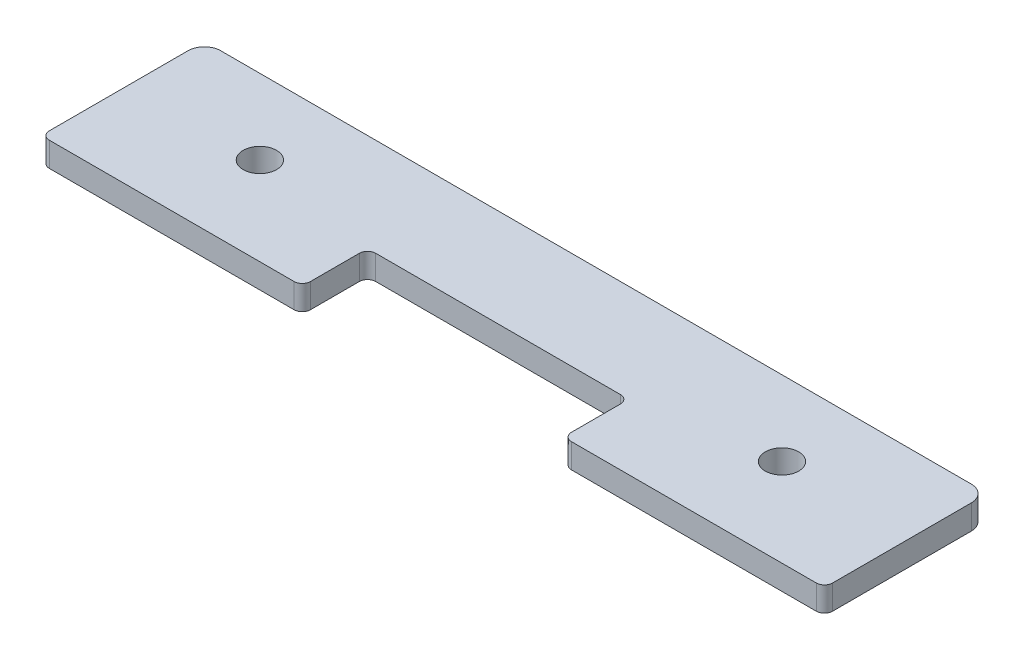
ISO-10303-21;
HEADER;
FILE_DESCRIPTION(('STEP AP214'),'2;1');
FILE_NAME('part.step','',(''),(''),'','','');
FILE_SCHEMA(('AUTOMOTIVE_DESIGN { 1 0 10303 214 1 1 1 1 }'));
ENDSEC;
DATA;
#1=APPLICATION_CONTEXT('core data for automotive mechanical design processes');
#2=APPLICATION_PROTOCOL_DEFINITION('international standard','automotive_design',2000,#1);
#3=PRODUCT_CONTEXT('',#1,'mechanical');
#4=PRODUCT('Part','Part','',(#3));
#5=PRODUCT_RELATED_PRODUCT_CATEGORY('part','',(#4));
#6=PRODUCT_DEFINITION_FORMATION('','',#4);
#7=PRODUCT_DEFINITION_CONTEXT('part definition',#1,'design');
#8=PRODUCT_DEFINITION('design','',#6,#7);
#9=PRODUCT_DEFINITION_SHAPE('','',#8);
#10=(LENGTH_UNIT() NAMED_UNIT(*) SI_UNIT(.MILLI.,.METRE.));
#11=(NAMED_UNIT(*) PLANE_ANGLE_UNIT() SI_UNIT($,.RADIAN.));
#12=(NAMED_UNIT(*) SI_UNIT($,.STERADIAN.) SOLID_ANGLE_UNIT());
#13=UNCERTAINTY_MEASURE_WITH_UNIT(LENGTH_MEASURE(1.E-05),#10,'distance_accuracy_value','');
#14=(GEOMETRIC_REPRESENTATION_CONTEXT(3) GLOBAL_UNCERTAINTY_ASSIGNED_CONTEXT((#13)) GLOBAL_UNIT_ASSIGNED_CONTEXT((#10,
#11,#12)) REPRESENTATION_CONTEXT('',''));
#15=CARTESIAN_POINT('',(0.,0.,0.));
#16=DIRECTION('',(0.,0.,1.));
#17=DIRECTION('',(1.,0.,0.));
#18=AXIS2_PLACEMENT_3D('',#15,#16,#17);
#19=CARTESIAN_POINT('',(47.,3.,-1.));
#20=DIRECTION('',(0.,-1.,0.));
#21=DIRECTION('',(0.,0.,-1.));
#22=AXIS2_PLACEMENT_3D('',#19,#20,#21);
#23=PLANE('',#22);
#24=CARTESIAN_POINT('',(47.,3.,-1.));
#25=DIRECTION('',(0.,1.,0.));
#26=DIRECTION('',(0.,0.,-1.));
#27=AXIS2_PLACEMENT_3D('',#24,#25,#26);
#28=CIRCLE('',#27,1.);
#29=CARTESIAN_POINT('',(47.,3.,0.));
#30=VERTEX_POINT('',#29);
#31=CARTESIAN_POINT('',(48.,3.,-1.00000000000001));
#32=VERTEX_POINT('',#31);
#33=EDGE_CURVE('E215',#30,#32,#28,.T.);
#34=ORIENTED_EDGE('',*,*,#33,.T.);
#35=DIRECTION('',(0.,0.,-1.));
#36=VECTOR('',#35,1.);
#37=CARTESIAN_POINT('',(48.,3.,-18.));
#38=LINE('',#37,#36);
#39=CARTESIAN_POINT('',(48.,3.,-18.));
#40=VERTEX_POINT('',#39);
#41=EDGE_CURVE('E123',#32,#40,#38,.T.);
#42=ORIENTED_EDGE('',*,*,#41,.T.);
#43=CARTESIAN_POINT('',(46.,3.,-18.));
#44=DIRECTION('',(0.,1.,0.));
#45=DIRECTION('',(0.,0.,1.));
#46=AXIS2_PLACEMENT_3D('',#43,#44,#45);
#47=CIRCLE('',#46,1.99999999999999);
#48=CARTESIAN_POINT('',(46.,3.,-20.));
#49=VERTEX_POINT('',#48);
#50=EDGE_CURVE('E254',#40,#49,#47,.T.);
#51=ORIENTED_EDGE('',*,*,#50,.T.);
#52=DIRECTION('',(-1.,0.,0.));
#53=VECTOR('',#52,1.);
#54=CARTESIAN_POINT('',(46.,3.,-20.));
#55=LINE('',#54,#53);
#56=CARTESIAN_POINT('',(-46.,3.,-20.));
#57=VERTEX_POINT('',#56);
#58=EDGE_CURVE('E273',#49,#57,#55,.T.);
#59=ORIENTED_EDGE('',*,*,#58,.T.);
#60=CARTESIAN_POINT('',(-46.,3.,-18.));
#61=DIRECTION('',(0.,1.,0.));
#62=DIRECTION('',(0.,0.,-1.));
#63=AXIS2_PLACEMENT_3D('',#60,#61,#62);
#64=CIRCLE('',#63,1.99999999999999);
#65=CARTESIAN_POINT('',(-48.,3.,-18.));
#66=VERTEX_POINT('',#65);
#67=EDGE_CURVE('E270',#57,#66,#64,.T.);
#68=ORIENTED_EDGE('',*,*,#67,.T.);
#69=DIRECTION('',(0.,0.,1.));
#70=VECTOR('',#69,1.);
#71=CARTESIAN_POINT('',(-48.,3.,-18.));
#72=LINE('',#71,#70);
#73=CARTESIAN_POINT('',(-48.,3.,-1.00000000000001));
#74=VERTEX_POINT('',#73);
#75=EDGE_CURVE('E272',#66,#74,#72,.T.);
#76=ORIENTED_EDGE('',*,*,#75,.T.);
#77=CARTESIAN_POINT('',(-47.,3.,-1.));
#78=DIRECTION('',(0.,1.,0.));
#79=DIRECTION('',(0.,0.,1.));
#80=AXIS2_PLACEMENT_3D('',#77,#78,#79);
#81=CIRCLE('',#80,1.);
#82=CARTESIAN_POINT('',(-47.,3.,0.));
#83=VERTEX_POINT('',#82);
#84=EDGE_CURVE('E275',#74,#83,#81,.T.);
#85=ORIENTED_EDGE('',*,*,#84,.T.);
#86=DIRECTION('',(1.,0.,0.));
#87=VECTOR('',#86,1.);
#88=CARTESIAN_POINT('',(-47.,3.,0.));
#89=LINE('',#88,#87);
#90=CARTESIAN_POINT('',(-17.,3.,0.));
#91=VERTEX_POINT('',#90);
#92=EDGE_CURVE('E281',#83,#91,#89,.T.);
#93=ORIENTED_EDGE('',*,*,#92,.T.);
#94=CARTESIAN_POINT('',(-17.,3.,-0.999999999999996));
#95=DIRECTION('',(0.,1.,0.));
#96=DIRECTION('',(0.,0.,1.));
#97=AXIS2_PLACEMENT_3D('',#94,#95,#96);
#98=CIRCLE('',#97,0.999999999999999);
#99=CARTESIAN_POINT('',(-16.,3.,-0.999999999999996));
#100=VERTEX_POINT('',#99);
#101=EDGE_CURVE('E283',#91,#100,#98,.T.);
#102=ORIENTED_EDGE('',*,*,#101,.T.);
#103=DIRECTION('',(0.,0.,-1.));
#104=VECTOR('',#103,1.);
#105=CARTESIAN_POINT('',(-16.,3.,-0.999999999999996));
#106=LINE('',#105,#104);
#107=CARTESIAN_POINT('',(-16.,3.,-7.));
#108=VERTEX_POINT('',#107);
#109=EDGE_CURVE('E285',#100,#108,#106,.T.);
#110=ORIENTED_EDGE('',*,*,#109,.T.);
#111=CARTESIAN_POINT('',(-15.,3.,-7.));
#112=DIRECTION('',(0.,-1.,0.));
#113=DIRECTION('',(0.,0.,-1.));
#114=AXIS2_PLACEMENT_3D('',#111,#112,#113);
#115=CIRCLE('',#114,1.);
#116=CARTESIAN_POINT('',(-15.,3.,-8.));
#117=VERTEX_POINT('',#116);
#118=EDGE_CURVE('E287',#108,#117,#115,.T.);
#119=ORIENTED_EDGE('',*,*,#118,.T.);
#120=DIRECTION('',(1.,0.,0.));
#121=VECTOR('',#120,1.);
#122=CARTESIAN_POINT('',(15.,3.,-8.));
#123=LINE('',#122,#121);
#124=CARTESIAN_POINT('',(15.,3.,-8.));
#125=VERTEX_POINT('',#124);
#126=EDGE_CURVE('E289',#117,#125,#123,.T.);
#127=ORIENTED_EDGE('',*,*,#126,.T.);
#128=CARTESIAN_POINT('',(15.,3.,-7.));
#129=DIRECTION('',(0.,-1.,0.));
#130=DIRECTION('',(0.,0.,1.));
#131=AXIS2_PLACEMENT_3D('',#128,#129,#130);
#132=CIRCLE('',#131,1.);
#133=CARTESIAN_POINT('',(16.,3.,-7.));
#134=VERTEX_POINT('',#133);
#135=EDGE_CURVE('E166',#125,#134,#132,.T.);
#136=ORIENTED_EDGE('',*,*,#135,.T.);
#137=DIRECTION('',(0.,0.,1.));
#138=VECTOR('',#137,1.);
#139=CARTESIAN_POINT('',(16.,3.,-0.999999999999996));
#140=LINE('',#139,#138);
#141=CARTESIAN_POINT('',(16.,3.,-0.999999999999996));
#142=VERTEX_POINT('',#141);
#143=EDGE_CURVE('E160',#134,#142,#140,.T.);
#144=ORIENTED_EDGE('',*,*,#143,.T.);
#145=CARTESIAN_POINT('',(17.,3.,-0.999999999999996));
#146=DIRECTION('',(0.,1.,0.));
#147=DIRECTION('',(0.,0.,-1.));
#148=AXIS2_PLACEMENT_3D('',#145,#146,#147);
#149=CIRCLE('',#148,0.999999999999999);
#150=CARTESIAN_POINT('',(17.,3.,0.));
#151=VERTEX_POINT('',#150);
#152=EDGE_CURVE('E164',#142,#151,#149,.T.);
#153=ORIENTED_EDGE('',*,*,#152,.T.);
#154=DIRECTION('',(1.,0.,0.));
#155=VECTOR('',#154,1.);
#156=CARTESIAN_POINT('',(47.,3.,0.));
#157=LINE('',#156,#155);
#158=EDGE_CURVE('E56',#151,#30,#157,.T.);
#159=ORIENTED_EDGE('',*,*,#158,.T.);
#160=EDGE_LOOP('',(#34,#42,#51,#59,#68,#76,#85,#93,#102,#110,#119,#127,#136,#144,#153,#159));
#161=FACE_BOUND('',#160,.T.);
#162=CARTESIAN_POINT('',(32.,3.,-10.8));
#163=DIRECTION('',(0.,1.,0.));
#164=DIRECTION('',(0.,0.,1.));
#165=AXIS2_PLACEMENT_3D('',#162,#163,#164);
#166=CIRCLE('',#165,2.04999999999999);
#167=CARTESIAN_POINT('',(32.,3.,-8.75000000000001));
#168=VERTEX_POINT('',#167);
#169=EDGE_CURVE('E188',#168,#168,#166,.T.);
#170=ORIENTED_EDGE('',*,*,#169,.F.);
#171=EDGE_LOOP('',(#170));
#172=FACE_BOUND('',#171,.T.);
#173=CARTESIAN_POINT('',(-32.,3.,-10.8));
#174=DIRECTION('',(0.,1.,0.));
#175=DIRECTION('',(0.,0.,-1.));
#176=AXIS2_PLACEMENT_3D('',#173,#174,#175);
#177=CIRCLE('',#176,2.05);
#178=CARTESIAN_POINT('',(-32.,3.,-12.85));
#179=VERTEX_POINT('',#178);
#180=EDGE_CURVE('E330',#179,#179,#177,.T.);
#181=ORIENTED_EDGE('',*,*,#180,.F.);
#182=EDGE_LOOP('',(#181));
#183=FACE_BOUND('',#182,.T.);
#184=ADVANCED_FACE('F39',(#161,#172,#183),#23,.F.);
#185=CARTESIAN_POINT('',(47.,0.,-1.));
#186=DIRECTION('',(0.,-1.,0.));
#187=DIRECTION('',(0.,0.,-1.));
#188=AXIS2_PLACEMENT_3D('',#185,#186,#187);
#189=PLANE('',#188);
#190=CARTESIAN_POINT('',(32.,0.,-10.8));
#191=DIRECTION('',(0.,1.,0.));
#192=DIRECTION('',(0.,0.,1.));
#193=AXIS2_PLACEMENT_3D('',#190,#191,#192);
#194=CIRCLE('',#193,2.04999999999999);
#195=CARTESIAN_POINT('',(32.,0.,-8.75000000000001));
#196=VERTEX_POINT('',#195);
#197=EDGE_CURVE('E335',#196,#196,#194,.T.);
#198=ORIENTED_EDGE('',*,*,#197,.T.);
#199=EDGE_LOOP('',(#198));
#200=FACE_BOUND('',#199,.T.);
#201=CARTESIAN_POINT('',(47.,0.,-1.));
#202=DIRECTION('',(0.,1.,0.));
#203=DIRECTION('',(0.,0.,-1.));
#204=AXIS2_PLACEMENT_3D('',#201,#202,#203);
#205=CIRCLE('',#204,1.);
#206=CARTESIAN_POINT('',(47.,0.,0.));
#207=VERTEX_POINT('',#206);
#208=CARTESIAN_POINT('',(48.,0.,-1.00000000000001));
#209=VERTEX_POINT('',#208);
#210=EDGE_CURVE('E184',#207,#209,#205,.T.);
#211=ORIENTED_EDGE('',*,*,#210,.F.);
#212=DIRECTION('',(1.,0.,0.));
#213=VECTOR('',#212,1.);
#214=CARTESIAN_POINT('',(47.,0.,0.));
#215=LINE('',#214,#213);
#216=CARTESIAN_POINT('',(17.,0.,0.));
#217=VERTEX_POINT('',#216);
#218=EDGE_CURVE('E115',#217,#207,#215,.T.);
#219=ORIENTED_EDGE('',*,*,#218,.F.);
#220=CARTESIAN_POINT('',(17.,0.,-0.999999999999996));
#221=DIRECTION('',(0.,1.,0.));
#222=DIRECTION('',(0.,0.,-1.));
#223=AXIS2_PLACEMENT_3D('',#220,#221,#222);
#224=CIRCLE('',#223,0.999999999999999);
#225=CARTESIAN_POINT('',(16.,0.,-0.999999999999996));
#226=VERTEX_POINT('',#225);
#227=EDGE_CURVE('E109',#226,#217,#224,.T.);
#228=ORIENTED_EDGE('',*,*,#227,.F.);
#229=DIRECTION('',(0.,0.,1.));
#230=VECTOR('',#229,1.);
#231=CARTESIAN_POINT('',(16.,0.,-0.999999999999996));
#232=LINE('',#231,#230);
#233=CARTESIAN_POINT('',(16.,0.,-7.));
#234=VERTEX_POINT('',#233);
#235=EDGE_CURVE('E174',#234,#226,#232,.T.);
#236=ORIENTED_EDGE('',*,*,#235,.F.);
#237=CARTESIAN_POINT('',(15.,0.,-7.));
#238=DIRECTION('',(0.,-1.,0.));
#239=DIRECTION('',(0.,0.,1.));
#240=AXIS2_PLACEMENT_3D('',#237,#238,#239);
#241=CIRCLE('',#240,1.);
#242=CARTESIAN_POINT('',(15.,0.,-8.));
#243=VERTEX_POINT('',#242);
#244=EDGE_CURVE('E210',#243,#234,#241,.T.);
#245=ORIENTED_EDGE('',*,*,#244,.F.);
#246=DIRECTION('',(1.,0.,0.));
#247=VECTOR('',#246,1.);
#248=CARTESIAN_POINT('',(15.,0.,-8.));
#249=LINE('',#248,#247);
#250=CARTESIAN_POINT('',(-15.,0.,-8.));
#251=VERTEX_POINT('',#250);
#252=EDGE_CURVE('E208',#251,#243,#249,.T.);
#253=ORIENTED_EDGE('',*,*,#252,.F.);
#254=CARTESIAN_POINT('',(-15.,0.,-7.));
#255=DIRECTION('',(0.,-1.,0.));
#256=DIRECTION('',(0.,0.,-1.));
#257=AXIS2_PLACEMENT_3D('',#254,#255,#256);
#258=CIRCLE('',#257,1.);
#259=CARTESIAN_POINT('',(-16.,0.,-7.));
#260=VERTEX_POINT('',#259);
#261=EDGE_CURVE('E206',#260,#251,#258,.T.);
#262=ORIENTED_EDGE('',*,*,#261,.F.);
#263=DIRECTION('',(0.,0.,-1.));
#264=VECTOR('',#263,1.);
#265=CARTESIAN_POINT('',(-16.,0.,-0.999999999999996));
#266=LINE('',#265,#264);
#267=CARTESIAN_POINT('',(-16.,0.,-0.999999999999996));
#268=VERTEX_POINT('',#267);
#269=EDGE_CURVE('E204',#268,#260,#266,.T.);
#270=ORIENTED_EDGE('',*,*,#269,.F.);
#271=CARTESIAN_POINT('',(-17.,0.,-0.999999999999996));
#272=DIRECTION('',(0.,1.,0.));
#273=DIRECTION('',(0.,0.,1.));
#274=AXIS2_PLACEMENT_3D('',#271,#272,#273);
#275=CIRCLE('',#274,0.999999999999999);
#276=CARTESIAN_POINT('',(-17.,0.,0.));
#277=VERTEX_POINT('',#276);
#278=EDGE_CURVE('E202',#277,#268,#275,.T.);
#279=ORIENTED_EDGE('',*,*,#278,.F.);
#280=DIRECTION('',(1.,0.,0.));
#281=VECTOR('',#280,1.);
#282=CARTESIAN_POINT('',(-47.,0.,0.));
#283=LINE('',#282,#281);
#284=CARTESIAN_POINT('',(-47.,0.,0.));
#285=VERTEX_POINT('',#284);
#286=EDGE_CURVE('E200',#285,#277,#283,.T.);
#287=ORIENTED_EDGE('',*,*,#286,.F.);
#288=CARTESIAN_POINT('',(-47.,0.,-1.));
#289=DIRECTION('',(0.,1.,0.));
#290=DIRECTION('',(0.,0.,1.));
#291=AXIS2_PLACEMENT_3D('',#288,#289,#290);
#292=CIRCLE('',#291,1.);
#293=CARTESIAN_POINT('',(-48.,0.,-1.00000000000001));
#294=VERTEX_POINT('',#293);
#295=EDGE_CURVE('E198',#294,#285,#292,.T.);
#296=ORIENTED_EDGE('',*,*,#295,.F.);
#297=DIRECTION('',(0.,0.,1.));
#298=VECTOR('',#297,1.);
#299=CARTESIAN_POINT('',(-48.,0.,-18.));
#300=LINE('',#299,#298);
#301=CARTESIAN_POINT('',(-48.,0.,-18.));
#302=VERTEX_POINT('',#301);
#303=EDGE_CURVE('E196',#302,#294,#300,.T.);
#304=ORIENTED_EDGE('',*,*,#303,.F.);
#305=CARTESIAN_POINT('',(-46.,0.,-18.));
#306=DIRECTION('',(0.,1.,0.));
#307=DIRECTION('',(0.,0.,-1.));
#308=AXIS2_PLACEMENT_3D('',#305,#306,#307);
#309=CIRCLE('',#308,1.99999999999999);
#310=CARTESIAN_POINT('',(-46.,0.,-20.));
#311=VERTEX_POINT('',#310);
#312=EDGE_CURVE('E194',#311,#302,#309,.T.);
#313=ORIENTED_EDGE('',*,*,#312,.F.);
#314=DIRECTION('',(-1.,0.,0.));
#315=VECTOR('',#314,1.);
#316=CARTESIAN_POINT('',(46.,0.,-20.));
#317=LINE('',#316,#315);
#318=CARTESIAN_POINT('',(46.,0.,-20.));
#319=VERTEX_POINT('',#318);
#320=EDGE_CURVE('E192',#319,#311,#317,.T.);
#321=ORIENTED_EDGE('',*,*,#320,.F.);
#322=CARTESIAN_POINT('',(46.,0.,-18.));
#323=DIRECTION('',(0.,1.,0.));
#324=DIRECTION('',(0.,0.,1.));
#325=AXIS2_PLACEMENT_3D('',#322,#323,#324);
#326=CIRCLE('',#325,1.99999999999999);
#327=CARTESIAN_POINT('',(48.,0.,-18.));
#328=VERTEX_POINT('',#327);
#329=EDGE_CURVE('E190',#328,#319,#326,.T.);
#330=ORIENTED_EDGE('',*,*,#329,.F.);
#331=DIRECTION('',(0.,0.,-1.));
#332=VECTOR('',#331,1.);
#333=CARTESIAN_POINT('',(48.,0.,-18.));
#334=LINE('',#333,#332);
#335=EDGE_CURVE('E187',#209,#328,#334,.T.);
#336=ORIENTED_EDGE('',*,*,#335,.F.);
#337=EDGE_LOOP('',(#211,#219,#228,#236,#245,#253,#262,#270,#279,#287,#296,#304,#313,#321,#330,#336));
#338=FACE_BOUND('',#337,.T.);
#339=CARTESIAN_POINT('',(-32.,0.,-10.8));
#340=DIRECTION('',(0.,1.,0.));
#341=DIRECTION('',(0.,0.,-1.));
#342=AXIS2_PLACEMENT_3D('',#339,#340,#341);
#343=CIRCLE('',#342,2.05);
#344=CARTESIAN_POINT('',(-32.,0.,-12.85));
#345=VERTEX_POINT('',#344);
#346=EDGE_CURVE('E333',#345,#345,#343,.T.);
#347=ORIENTED_EDGE('',*,*,#346,.T.);
#348=EDGE_LOOP('',(#347));
#349=FACE_BOUND('',#348,.T.);
#350=ADVANCED_FACE('F258',(#200,#338,#349),#189,.T.);
#351=CARTESIAN_POINT('',(47.,3.,-1.));
#352=DIRECTION('',(0.,-1.,0.));
#353=DIRECTION('',(0.,0.,-1.));
#354=AXIS2_PLACEMENT_3D('',#351,#352,#353);
#355=CYLINDRICAL_SURFACE('',#354,1.);
#356=ORIENTED_EDGE('',*,*,#210,.T.);
#357=DIRECTION('',(0.,-1.,0.));
#358=VECTOR('',#357,1.);
#359=CARTESIAN_POINT('',(48.,3.,-1.00000000000001));
#360=LINE('',#359,#358);
#361=EDGE_CURVE('E11',#32,#209,#360,.T.);
#362=ORIENTED_EDGE('',*,*,#361,.F.);
#363=ORIENTED_EDGE('',*,*,#33,.F.);
#364=DIRECTION('',(0.,-1.,0.));
#365=VECTOR('',#364,1.);
#366=CARTESIAN_POINT('',(47.,3.,0.));
#367=LINE('',#366,#365);
#368=EDGE_CURVE('E180',#30,#207,#367,.T.);
#369=ORIENTED_EDGE('',*,*,#368,.T.);
#370=EDGE_LOOP('',(#356,#362,#363,#369));
#371=FACE_BOUND('',#370,.T.);
#372=ADVANCED_FACE('F41',(#371),#355,.T.);
#373=CARTESIAN_POINT('',(48.,3.,-18.));
#374=DIRECTION('',(-1.,0.,0.));
#375=DIRECTION('',(0.,0.,1.));
#376=AXIS2_PLACEMENT_3D('',#373,#374,#375);
#377=PLANE('',#376);
#378=ORIENTED_EDGE('',*,*,#335,.T.);
#379=DIRECTION('',(0.,-1.,0.));
#380=VECTOR('',#379,1.);
#381=CARTESIAN_POINT('',(48.,3.,-18.));
#382=LINE('',#381,#380);
#383=EDGE_CURVE('E48',#40,#328,#382,.T.);
#384=ORIENTED_EDGE('',*,*,#383,.F.);
#385=ORIENTED_EDGE('',*,*,#41,.F.);
#386=ORIENTED_EDGE('',*,*,#361,.T.);
#387=EDGE_LOOP('',(#378,#384,#385,#386));
#388=FACE_BOUND('',#387,.T.);
#389=ADVANCED_FACE('F470',(#388),#377,.F.);
#390=CARTESIAN_POINT('',(46.,3.,-18.));
#391=DIRECTION('',(0.,-1.,0.));
#392=DIRECTION('',(0.,0.,-1.));
#393=AXIS2_PLACEMENT_3D('',#390,#391,#392);
#394=CYLINDRICAL_SURFACE('',#393,1.99999999999999);
#395=ORIENTED_EDGE('',*,*,#329,.T.);
#396=DIRECTION('',(0.,-1.,0.));
#397=VECTOR('',#396,1.);
#398=CARTESIAN_POINT('',(46.,3.,-20.));
#399=LINE('',#398,#397);
#400=EDGE_CURVE('E246',#49,#319,#399,.T.);
#401=ORIENTED_EDGE('',*,*,#400,.F.);
#402=ORIENTED_EDGE('',*,*,#50,.F.);
#403=ORIENTED_EDGE('',*,*,#383,.T.);
#404=EDGE_LOOP('',(#395,#401,#402,#403));
#405=FACE_BOUND('',#404,.T.);
#406=ADVANCED_FACE('F252',(#405),#394,.T.);
#407=CARTESIAN_POINT('',(46.,3.,-20.));
#408=DIRECTION('',(0.,0.,1.));
#409=DIRECTION('',(1.,0.,0.));
#410=AXIS2_PLACEMENT_3D('',#407,#408,#409);
#411=PLANE('',#410);
#412=ORIENTED_EDGE('',*,*,#320,.T.);
#413=DIRECTION('',(0.,-1.,0.));
#414=VECTOR('',#413,1.);
#415=CARTESIAN_POINT('',(-46.,3.,-20.));
#416=LINE('',#415,#414);
#417=EDGE_CURVE('E243',#57,#311,#416,.T.);
#418=ORIENTED_EDGE('',*,*,#417,.F.);
#419=ORIENTED_EDGE('',*,*,#58,.F.);
#420=ORIENTED_EDGE('',*,*,#400,.T.);
#421=EDGE_LOOP('',(#412,#418,#419,#420));
#422=FACE_BOUND('',#421,.T.);
#423=ADVANCED_FACE('F264',(#422),#411,.F.);
#424=CARTESIAN_POINT('',(-46.,3.,-18.));
#425=DIRECTION('',(0.,-1.,0.));
#426=DIRECTION('',(0.,0.,-1.));
#427=AXIS2_PLACEMENT_3D('',#424,#425,#426);
#428=CYLINDRICAL_SURFACE('',#427,1.99999999999999);
#429=ORIENTED_EDGE('',*,*,#312,.T.);
#430=DIRECTION('',(0.,-1.,0.));
#431=VECTOR('',#430,1.);
#432=CARTESIAN_POINT('',(-48.,3.,-18.));
#433=LINE('',#432,#431);
#434=EDGE_CURVE('E240',#66,#302,#433,.T.);
#435=ORIENTED_EDGE('',*,*,#434,.F.);
#436=ORIENTED_EDGE('',*,*,#67,.F.);
#437=ORIENTED_EDGE('',*,*,#417,.T.);
#438=EDGE_LOOP('',(#429,#435,#436,#437));
#439=FACE_BOUND('',#438,.T.);
#440=ADVANCED_FACE('F268',(#439),#428,.T.);
#441=CARTESIAN_POINT('',(-48.,3.,-18.));
#442=DIRECTION('',(1.,0.,0.));
#443=DIRECTION('',(0.,0.,-1.));
#444=AXIS2_PLACEMENT_3D('',#441,#442,#443);
#445=PLANE('',#444);
#446=ORIENTED_EDGE('',*,*,#303,.T.);
#447=DIRECTION('',(0.,-1.,0.));
#448=VECTOR('',#447,1.);
#449=CARTESIAN_POINT('',(-48.,3.,-1.00000000000001));
#450=LINE('',#449,#448);
#451=EDGE_CURVE('E237',#74,#294,#450,.T.);
#452=ORIENTED_EDGE('',*,*,#451,.F.);
#453=ORIENTED_EDGE('',*,*,#75,.F.);
#454=ORIENTED_EDGE('',*,*,#434,.T.);
#455=EDGE_LOOP('',(#446,#452,#453,#454));
#456=FACE_BOUND('',#455,.T.);
#457=ADVANCED_FACE('F435',(#456),#445,.F.);
#458=CARTESIAN_POINT('',(-47.,3.,-1.));
#459=DIRECTION('',(0.,-1.,0.));
#460=DIRECTION('',(0.,0.,-1.));
#461=AXIS2_PLACEMENT_3D('',#458,#459,#460);
#462=CYLINDRICAL_SURFACE('',#461,1.);
#463=ORIENTED_EDGE('',*,*,#295,.T.);
#464=DIRECTION('',(0.,-1.,0.));
#465=VECTOR('',#464,1.);
#466=CARTESIAN_POINT('',(-47.,3.,0.));
#467=LINE('',#466,#465);
#468=EDGE_CURVE('E234',#83,#285,#467,.T.);
#469=ORIENTED_EDGE('',*,*,#468,.F.);
#470=ORIENTED_EDGE('',*,*,#84,.F.);
#471=ORIENTED_EDGE('',*,*,#451,.T.);
#472=EDGE_LOOP('',(#463,#469,#470,#471));
#473=FACE_BOUND('',#472,.T.);
#474=ADVANCED_FACE('F425',(#473),#462,.T.);
#475=CARTESIAN_POINT('',(-47.,3.,0.));
#476=DIRECTION('',(0.,0.,-1.));
#477=DIRECTION('',(-1.,0.,0.));
#478=AXIS2_PLACEMENT_3D('',#475,#476,#477);
#479=PLANE('',#478);
#480=ORIENTED_EDGE('',*,*,#286,.T.);
#481=DIRECTION('',(0.,-1.,0.));
#482=VECTOR('',#481,1.);
#483=CARTESIAN_POINT('',(-17.,3.,0.));
#484=LINE('',#483,#482);
#485=EDGE_CURVE('E231',#91,#277,#484,.T.);
#486=ORIENTED_EDGE('',*,*,#485,.F.);
#487=ORIENTED_EDGE('',*,*,#92,.F.);
#488=ORIENTED_EDGE('',*,*,#468,.T.);
#489=EDGE_LOOP('',(#480,#486,#487,#488));
#490=FACE_BOUND('',#489,.T.);
#491=ADVANCED_FACE('F415',(#490),#479,.F.);
#492=CARTESIAN_POINT('',(-17.,3.,-0.999999999999996));
#493=DIRECTION('',(0.,-1.,0.));
#494=DIRECTION('',(0.,0.,-1.));
#495=AXIS2_PLACEMENT_3D('',#492,#493,#494);
#496=CYLINDRICAL_SURFACE('',#495,0.999999999999999);
#497=ORIENTED_EDGE('',*,*,#278,.T.);
#498=DIRECTION('',(0.,-1.,0.));
#499=VECTOR('',#498,1.);
#500=CARTESIAN_POINT('',(-16.,3.,-0.999999999999996));
#501=LINE('',#500,#499);
#502=EDGE_CURVE('E228',#100,#268,#501,.T.);
#503=ORIENTED_EDGE('',*,*,#502,.F.);
#504=ORIENTED_EDGE('',*,*,#101,.F.);
#505=ORIENTED_EDGE('',*,*,#485,.T.);
#506=EDGE_LOOP('',(#497,#503,#504,#505));
#507=FACE_BOUND('',#506,.T.);
#508=ADVANCED_FACE('F405',(#507),#496,.T.);
#509=CARTESIAN_POINT('',(-16.,3.,-0.999999999999996));
#510=DIRECTION('',(-1.,0.,0.));
#511=DIRECTION('',(0.,0.,1.));
#512=AXIS2_PLACEMENT_3D('',#509,#510,#511);
#513=PLANE('',#512);
#514=ORIENTED_EDGE('',*,*,#269,.T.);
#515=DIRECTION('',(0.,-1.,0.));
#516=VECTOR('',#515,1.);
#517=CARTESIAN_POINT('',(-16.,3.,-7.));
#518=LINE('',#517,#516);
#519=EDGE_CURVE('E225',#108,#260,#518,.T.);
#520=ORIENTED_EDGE('',*,*,#519,.F.);
#521=ORIENTED_EDGE('',*,*,#109,.F.);
#522=ORIENTED_EDGE('',*,*,#502,.T.);
#523=EDGE_LOOP('',(#514,#520,#521,#522));
#524=FACE_BOUND('',#523,.T.);
#525=ADVANCED_FACE('F395',(#524),#513,.F.);
#526=CARTESIAN_POINT('',(-15.,3.,-7.));
#527=DIRECTION('',(0.,-1.,0.));
#528=DIRECTION('',(0.,0.,-1.));
#529=AXIS2_PLACEMENT_3D('',#526,#527,#528);
#530=CYLINDRICAL_SURFACE('',#529,1.);
#531=ORIENTED_EDGE('',*,*,#261,.T.);
#532=DIRECTION('',(0.,-1.,0.));
#533=VECTOR('',#532,1.);
#534=CARTESIAN_POINT('',(-15.,3.,-8.));
#535=LINE('',#534,#533);
#536=EDGE_CURVE('E222',#117,#251,#535,.T.);
#537=ORIENTED_EDGE('',*,*,#536,.F.);
#538=ORIENTED_EDGE('',*,*,#118,.F.);
#539=ORIENTED_EDGE('',*,*,#519,.T.);
#540=EDGE_LOOP('',(#531,#537,#538,#539));
#541=FACE_BOUND('',#540,.T.);
#542=ADVANCED_FACE('F386',(#541),#530,.F.);
#543=CARTESIAN_POINT('',(15.,3.,-8.));
#544=DIRECTION('',(0.,0.,-1.));
#545=DIRECTION('',(-1.,0.,0.));
#546=AXIS2_PLACEMENT_3D('',#543,#544,#545);
#547=PLANE('',#546);
#548=ORIENTED_EDGE('',*,*,#252,.T.);
#549=DIRECTION('',(0.,-1.,0.));
#550=VECTOR('',#549,1.);
#551=CARTESIAN_POINT('',(15.,3.,-8.));
#552=LINE('',#551,#550);
#553=EDGE_CURVE('E219',#125,#243,#552,.T.);
#554=ORIENTED_EDGE('',*,*,#553,.F.);
#555=ORIENTED_EDGE('',*,*,#126,.F.);
#556=ORIENTED_EDGE('',*,*,#536,.T.);
#557=EDGE_LOOP('',(#548,#554,#555,#556));
#558=FACE_BOUND('',#557,.T.);
#559=ADVANCED_FACE('F295',(#558),#547,.F.);
#560=CARTESIAN_POINT('',(15.,3.,-7.));
#561=DIRECTION('',(0.,-1.,0.));
#562=DIRECTION('',(0.,0.,-1.));
#563=AXIS2_PLACEMENT_3D('',#560,#561,#562);
#564=CYLINDRICAL_SURFACE('',#563,1.);
#565=ORIENTED_EDGE('',*,*,#244,.T.);
#566=DIRECTION('',(0.,-1.,0.));
#567=VECTOR('',#566,1.);
#568=CARTESIAN_POINT('',(16.,3.,-7.));
#569=LINE('',#568,#567);
#570=EDGE_CURVE('E175',#134,#234,#569,.T.);
#571=ORIENTED_EDGE('',*,*,#570,.F.);
#572=ORIENTED_EDGE('',*,*,#135,.F.);
#573=ORIENTED_EDGE('',*,*,#553,.T.);
#574=EDGE_LOOP('',(#565,#571,#572,#573));
#575=FACE_BOUND('',#574,.T.);
#576=ADVANCED_FACE('F299',(#575),#564,.F.);
#577=CARTESIAN_POINT('',(16.,3.,-0.999999999999996));
#578=DIRECTION('',(1.,0.,0.));
#579=DIRECTION('',(0.,0.,-1.));
#580=AXIS2_PLACEMENT_3D('',#577,#578,#579);
#581=PLANE('',#580);
#582=ORIENTED_EDGE('',*,*,#235,.T.);
#583=DIRECTION('',(0.,-1.,0.));
#584=VECTOR('',#583,1.);
#585=CARTESIAN_POINT('',(16.,3.,-0.999999999999996));
#586=LINE('',#585,#584);
#587=EDGE_CURVE('E171',#142,#226,#586,.T.);
#588=ORIENTED_EDGE('',*,*,#587,.F.);
#589=ORIENTED_EDGE('',*,*,#143,.F.);
#590=ORIENTED_EDGE('',*,*,#570,.T.);
#591=EDGE_LOOP('',(#582,#588,#589,#590));
#592=FACE_BOUND('',#591,.T.);
#593=ADVANCED_FACE('F172',(#592),#581,.F.);
#594=CARTESIAN_POINT('',(17.,3.,-0.999999999999996));
#595=DIRECTION('',(0.,-1.,0.));
#596=DIRECTION('',(0.,0.,-1.));
#597=AXIS2_PLACEMENT_3D('',#594,#595,#596);
#598=CYLINDRICAL_SURFACE('',#597,0.999999999999999);
#599=ORIENTED_EDGE('',*,*,#227,.T.);
#600=DIRECTION('',(0.,-1.,0.));
#601=VECTOR('',#600,1.);
#602=CARTESIAN_POINT('',(17.,3.,0.));
#603=LINE('',#602,#601);
#604=EDGE_CURVE('E176',#151,#217,#603,.T.);
#605=ORIENTED_EDGE('',*,*,#604,.F.);
#606=ORIENTED_EDGE('',*,*,#152,.F.);
#607=ORIENTED_EDGE('',*,*,#587,.T.);
#608=EDGE_LOOP('',(#599,#605,#606,#607));
#609=FACE_BOUND('',#608,.T.);
#610=ADVANCED_FACE('F178',(#609),#598,.T.);
#611=CARTESIAN_POINT('',(47.,3.,0.));
#612=DIRECTION('',(0.,0.,-1.));
#613=DIRECTION('',(-1.,0.,0.));
#614=AXIS2_PLACEMENT_3D('',#611,#612,#613);
#615=PLANE('',#614);
#616=ORIENTED_EDGE('',*,*,#218,.T.);
#617=ORIENTED_EDGE('',*,*,#368,.F.);
#618=ORIENTED_EDGE('',*,*,#158,.F.);
#619=ORIENTED_EDGE('',*,*,#604,.T.);
#620=EDGE_LOOP('',(#616,#617,#618,#619));
#621=FACE_BOUND('',#620,.T.);
#622=ADVANCED_FACE('F303',(#621),#615,.F.);
#623=CARTESIAN_POINT('',(32.,3.,-10.8));
#624=DIRECTION('',(0.,-1.,0.));
#625=DIRECTION('',(0.,0.,-1.));
#626=AXIS2_PLACEMENT_3D('',#623,#624,#625);
#627=CYLINDRICAL_SURFACE('',#626,2.04999999999999);
#628=ORIENTED_EDGE('',*,*,#169,.T.);
#629=EDGE_LOOP('',(#628));
#630=FACE_BOUND('',#629,.T.);
#631=ORIENTED_EDGE('',*,*,#197,.F.);
#632=EDGE_LOOP('',(#631));
#633=FACE_BOUND('',#632,.T.);
#634=ADVANCED_FACE('F305',(#630,#633),#627,.F.);
#635=CARTESIAN_POINT('',(-32.,3.,-10.8));
#636=DIRECTION('',(0.,-1.,0.));
#637=DIRECTION('',(0.,0.,-1.));
#638=AXIS2_PLACEMENT_3D('',#635,#636,#637);
#639=CYLINDRICAL_SURFACE('',#638,2.05);
#640=ORIENTED_EDGE('',*,*,#180,.T.);
#641=EDGE_LOOP('',(#640));
#642=FACE_BOUND('',#641,.T.);
#643=ORIENTED_EDGE('',*,*,#346,.F.);
#644=EDGE_LOOP('',(#643));
#645=FACE_BOUND('',#644,.T.);
#646=ADVANCED_FACE('F311',(#642,#645),#639,.F.);
#647=CLOSED_SHELL('',(#184,#350,#372,#389,#406,#423,#440,#457,#474,#491,#508,#525,#542,#559,
#576,#593,#610,#622,#634,#646));
#648=MANIFOLD_SOLID_BREP('B2',#647);
#649=ADVANCED_BREP_SHAPE_REPRESENTATION('',(#18,#648),#14);
#650=SHAPE_DEFINITION_REPRESENTATION(#9,#649);
ENDSEC;
END-ISO-10303-21;
